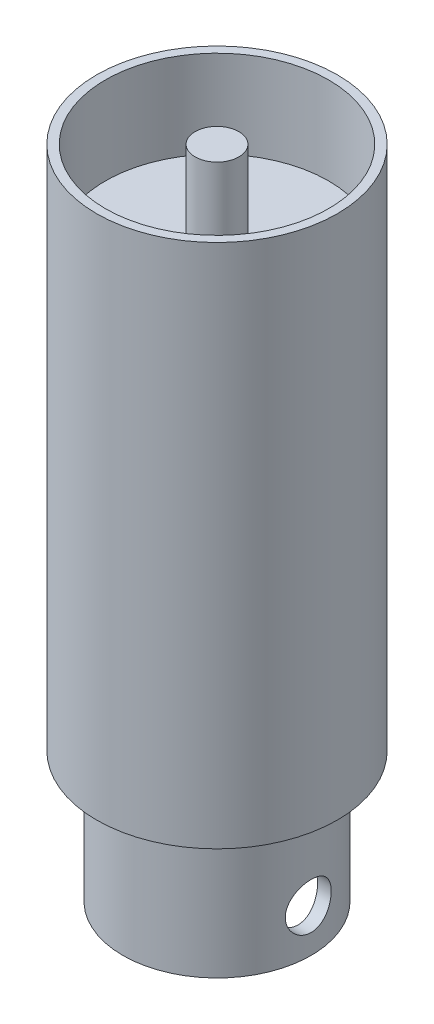
ISO-10303-21;
HEADER;
FILE_DESCRIPTION(('STEP AP214'),'2;1');
FILE_NAME('part.step','',(''),(''),'','','');
FILE_SCHEMA(('AUTOMOTIVE_DESIGN { 1 0 10303 214 1 1 1 1 }'));
ENDSEC;
DATA;
#1=APPLICATION_CONTEXT('core data for automotive mechanical design processes');
#2=APPLICATION_PROTOCOL_DEFINITION('international standard','automotive_design',2000,#1);
#3=PRODUCT_CONTEXT('',#1,'mechanical');
#4=PRODUCT('Part','Part','',(#3));
#5=PRODUCT_RELATED_PRODUCT_CATEGORY('part','',(#4));
#6=PRODUCT_DEFINITION_FORMATION('','',#4);
#7=PRODUCT_DEFINITION_CONTEXT('part definition',#1,'design');
#8=PRODUCT_DEFINITION('design','',#6,#7);
#9=PRODUCT_DEFINITION_SHAPE('','',#8);
#10=(LENGTH_UNIT() NAMED_UNIT(*) SI_UNIT(.MILLI.,.METRE.));
#11=(NAMED_UNIT(*) PLANE_ANGLE_UNIT() SI_UNIT($,.RADIAN.));
#12=(NAMED_UNIT(*) SI_UNIT($,.STERADIAN.) SOLID_ANGLE_UNIT());
#13=UNCERTAINTY_MEASURE_WITH_UNIT(LENGTH_MEASURE(1.E-05),#10,'distance_accuracy_value','');
#14=(GEOMETRIC_REPRESENTATION_CONTEXT(3) GLOBAL_UNCERTAINTY_ASSIGNED_CONTEXT((#13)) GLOBAL_UNIT_ASSIGNED_CONTEXT((#10,
#11,#12)) REPRESENTATION_CONTEXT('',''));
#15=CARTESIAN_POINT('',(0.,0.,0.));
#16=DIRECTION('',(0.,0.,1.));
#17=DIRECTION('',(1.,0.,0.));
#18=AXIS2_PLACEMENT_3D('',#15,#16,#17);
#19=CARTESIAN_POINT('',(0.,60.,0.));
#20=DIRECTION('',(0.,-1.,0.));
#21=DIRECTION('',(0.,0.,-1.));
#22=AXIS2_PLACEMENT_3D('',#19,#20,#21);
#23=CYLINDRICAL_SURFACE('',#22,13.75);
#24=CARTESIAN_POINT('',(0.,60.,0.));
#25=DIRECTION('',(0.,1.,0.));
#26=DIRECTION('',(0.,0.,1.));
#27=AXIS2_PLACEMENT_3D('',#24,#25,#26);
#28=CIRCLE('',#27,13.75);
#29=CARTESIAN_POINT('',(0.,60.,13.75));
#30=VERTEX_POINT('',#29);
#31=EDGE_CURVE('E58',#30,#30,#28,.T.);
#32=ORIENTED_EDGE('',*,*,#31,.F.);
#33=EDGE_LOOP('',(#32));
#34=FACE_BOUND('',#33,.T.);
#35=CARTESIAN_POINT('',(0.,0.,0.));
#36=DIRECTION('',(0.,1.,0.));
#37=DIRECTION('',(0.,0.,1.));
#38=AXIS2_PLACEMENT_3D('',#35,#36,#37);
#39=CIRCLE('',#38,13.75);
#40=CARTESIAN_POINT('',(0.,0.,13.75));
#41=VERTEX_POINT('',#40);
#42=EDGE_CURVE('E125',#41,#41,#39,.T.);
#43=ORIENTED_EDGE('',*,*,#42,.T.);
#44=EDGE_LOOP('',(#43));
#45=FACE_BOUND('',#44,.T.);
#46=ADVANCED_FACE('F45',(#34,#45),#23,.T.);
#47=CARTESIAN_POINT('',(0.,60.,0.));
#48=DIRECTION('',(0.,1.,0.));
#49=DIRECTION('',(0.,0.,1.));
#50=AXIS2_PLACEMENT_3D('',#47,#48,#49);
#51=PLANE('',#50);
#52=CARTESIAN_POINT('',(0.,60.,0.));
#53=DIRECTION('',(0.,1.,0.));
#54=DIRECTION('',(0.,0.,1.));
#55=AXIS2_PLACEMENT_3D('',#52,#53,#54);
#56=CIRCLE('',#55,12.75);
#57=CARTESIAN_POINT('',(0.,60.,12.75));
#58=VERTEX_POINT('',#57);
#59=EDGE_CURVE('E162',#58,#58,#56,.T.);
#60=ORIENTED_EDGE('',*,*,#59,.F.);
#61=EDGE_LOOP('',(#60));
#62=FACE_BOUND('',#61,.T.);
#63=ORIENTED_EDGE('',*,*,#31,.T.);
#64=EDGE_LOOP('',(#63));
#65=FACE_BOUND('',#64,.T.);
#66=ADVANCED_FACE('F178',(#62,#65),#51,.T.);
#67=CARTESIAN_POINT('',(0.,0.,0.));
#68=DIRECTION('',(0.,1.,0.));
#69=DIRECTION('',(0.,0.,1.));
#70=AXIS2_PLACEMENT_3D('',#67,#68,#69);
#71=PLANE('',#70);
#72=CARTESIAN_POINT('',(0.,0.,0.));
#73=DIRECTION('',(0.,1.,0.));
#74=DIRECTION('',(0.,0.,1.));
#75=AXIS2_PLACEMENT_3D('',#72,#73,#74);
#76=CIRCLE('',#75,10.75);
#77=CARTESIAN_POINT('',(0.,0.,10.75));
#78=VERTEX_POINT('',#77);
#79=EDGE_CURVE('E11',#78,#78,#76,.F.);
#80=ORIENTED_EDGE('',*,*,#79,.F.);
#81=EDGE_LOOP('',(#80));
#82=FACE_BOUND('',#81,.T.);
#83=ORIENTED_EDGE('',*,*,#42,.F.);
#84=EDGE_LOOP('',(#83));
#85=FACE_BOUND('',#84,.T.);
#86=ADVANCED_FACE('F171',(#82,#85),#71,.F.);
#87=CARTESIAN_POINT('',(0.,-14.9,0.));
#88=DIRECTION('',(0.,1.,0.));
#89=DIRECTION('',(0.,0.,1.));
#90=AXIS2_PLACEMENT_3D('',#87,#88,#89);
#91=CYLINDRICAL_SURFACE('',#90,9.25);
#92=CARTESIAN_POINT('',(-8.8697167373034,-10.,-2.625));
#93=CARTESIAN_POINT('',(-8.86971881552217,-9.85577529620719,-2.62499730258304));
#94=CARTESIAN_POINT('',(-8.87327293611824,-9.71152321388674,-2.61307337610954));
#95=CARTESIAN_POINT('',(-8.88705586606189,-9.42721074644726,-2.56579916746884));
#96=CARTESIAN_POINT('',(-8.89728745533017,-9.28715213253599,-2.5304391284349));
#97=CARTESIAN_POINT('',(-8.92317525097749,-9.01538180248594,-2.43756942595713));
#98=CARTESIAN_POINT('',(-8.93882313500438,-8.88365764529001,-2.38009372905987));
#99=CARTESIAN_POINT('',(-8.97376947150416,-8.63169471573319,-2.24473341498614));
#100=CARTESIAN_POINT('',(-8.9930683420725,-8.51145726115625,-2.16684646000531));
#101=CARTESIAN_POINT('',(-9.03375484194912,-8.28247611470968,-1.99051449147671));
#102=CARTESIAN_POINT('',(-9.0551833201506,-8.17410585310394,-1.89159386852323));
#103=CARTESIAN_POINT('',(-9.09736385817436,-7.97524886798926,-1.67702364204737));
#104=CARTESIAN_POINT('',(-9.11811583954239,-7.88476421258003,-1.56137210661621));
#105=CARTESIAN_POINT('',(-9.15706513466771,-7.72265769220686,-1.31399997464329));
#106=CARTESIAN_POINT('',(-9.17520867139229,-7.65141183377415,-1.18202376998814));
#107=CARTESIAN_POINT('',(-9.20642515659199,-7.53226569223404,-0.907363180997246));
#108=CARTESIAN_POINT('',(-9.21949907828465,-7.48436092786705,-0.764680858205653));
#109=CARTESIAN_POINT('',(-9.23881432660817,-7.41447898486085,-0.476560757863444));
#110=CARTESIAN_POINT('',(-9.24522304704051,-7.39186546507399,-0.331288742905194));
#111=CARTESIAN_POINT('',(-9.2510731886142,-7.37120084867576,-0.0388809061629942));
#112=CARTESIAN_POINT('',(-9.25051592427905,-7.37314511786164,0.108254558741657));
#113=CARTESIAN_POINT('',(-9.24261738001303,-7.4011032399804,0.395766031935412));
#114=CARTESIAN_POINT('',(-9.23547009915249,-7.42642881394942,0.536215125603046));
#115=CARTESIAN_POINT('',(-9.21542691959906,-7.49931254133875,0.810781239327962));
#116=CARTESIAN_POINT('',(-9.20253067320782,-7.54687203947884,0.944897875854568));
#117=CARTESIAN_POINT('',(-9.17216066022366,-7.66336996115971,1.20468830531623));
#118=CARTESIAN_POINT('',(-9.15463880954069,-7.73253444504456,1.33025487342421));
#119=CARTESIAN_POINT('',(-9.11689103898823,-7.89010299312113,1.56822697167863));
#120=CARTESIAN_POINT('',(-9.09666453357374,-7.97851122610331,1.68062964199072));
#121=CARTESIAN_POINT('',(-9.05485911729877,-8.17567022346683,1.893192372139));
#122=CARTESIAN_POINT('',(-9.03325762939616,-8.28501954036206,1.99279351367796));
#123=CARTESIAN_POINT('',(-8.99175923476624,-8.51908732205502,2.17239160265296));
#124=CARTESIAN_POINT('',(-8.97186246258793,-8.6438069981064,2.25238700358167));
#125=CARTESIAN_POINT('',(-8.9359265787378,-8.906415690026,2.39100532617832));
#126=CARTESIAN_POINT('',(-8.91991869717026,-9.04439964980289,2.44945705640036));
#127=CARTESIAN_POINT('',(-8.89395103412583,-9.32880754617821,2.54214040142022));
#128=CARTESIAN_POINT('',(-8.88398952057391,-9.47522905253908,2.57637895291968));
#129=CARTESIAN_POINT('',(-8.87161714143981,-9.76708181578993,2.61866025655436));
#130=CARTESIAN_POINT('',(-8.86896376616393,-9.91238097149148,2.62754472135811));
#131=CARTESIAN_POINT('',(-8.87084099697169,-10.2023928748681,2.62120055398988));
#132=CARTESIAN_POINT('',(-8.87537072097517,-10.3471056923575,2.60597488252805));
#133=CARTESIAN_POINT('',(-8.89086758743564,-10.6284620917492,2.55258864636305));
#134=CARTESIAN_POINT('',(-8.9016875779512,-10.7652139745391,2.51495188469431));
#135=CARTESIAN_POINT('',(-8.92839771035769,-11.0304589828334,2.41840991354142));
#136=CARTESIAN_POINT('',(-8.94428857681693,-11.1589509249354,2.35950166445444));
#137=CARTESIAN_POINT('',(-8.97983389567989,-11.4075011531144,2.22043672518827));
#138=CARTESIAN_POINT('',(-8.9995708997842,-11.5272762676384,2.13979553162373));
#139=CARTESIAN_POINT('',(-9.0403990372854,-11.7519027970648,1.96014162217962));
#140=CARTESIAN_POINT('',(-9.06149045947992,-11.8567510137244,1.86112497960677));
#141=CARTESIAN_POINT('',(-9.10349996320064,-12.0521347533708,1.64360532320447));
#142=CARTESIAN_POINT('',(-9.12438895321019,-12.14207832725,1.52456377431862));
#143=CARTESIAN_POINT('',(-9.16292695442611,-12.3007161874911,1.2725913698219));
#144=CARTESIAN_POINT('',(-9.18057613566941,-12.369411589164,1.13966124370895));
#145=CARTESIAN_POINT('',(-9.21053325330265,-12.4829491278337,0.864608422170627));
#146=CARTESIAN_POINT('',(-9.22288148082646,-12.5279718061838,0.722564856781578));
#147=CARTESIAN_POINT('',(-9.24102329484759,-12.5933834396975,0.432519751360427));
#148=CARTESIAN_POINT('',(-9.24681854283938,-12.6137786391967,0.284519731435076));
#149=CARTESIAN_POINT('',(-9.25111154249764,-12.6289227563912,-0.00773788647497587));
#150=CARTESIAN_POINT('',(-9.24985490125331,-12.6245348002913,-0.15194774396092));
#151=CARTESIAN_POINT('',(-9.24075248154151,-12.5922708683375,-0.437491494590992));
#152=CARTESIAN_POINT('',(-9.23290701123292,-12.5643959909644,-0.57882552192079));
#153=CARTESIAN_POINT('',(-9.21156820420505,-12.4864619863723,-0.853422755174489));
#154=CARTESIAN_POINT('',(-9.1981246794634,-12.4365982922259,-0.986745558917899));
#155=CARTESIAN_POINT('',(-9.1669866259515,-12.3162759174661,-1.2432066265273));
#156=CARTESIAN_POINT('',(-9.14929144501282,-12.24581407691,-1.36634332403081));
#157=CARTESIAN_POINT('',(-9.11087788579482,-12.0838843411139,-1.60287019088081));
#158=CARTESIAN_POINT('',(-9.09008586507005,-11.9918593005998,-1.71586690257861));
#159=CARTESIAN_POINT('',(-9.04808733297896,-11.7904451494235,-1.92510454072038));
#160=CARTESIAN_POINT('',(-9.02688070911617,-11.6810512669957,-2.02134084727552));
#161=CARTESIAN_POINT('',(-8.98581645713702,-11.444611363161,-2.19680412812974));
#162=CARTESIAN_POINT('',(-8.96600777661294,-11.3171825982681,-2.27552795536924));
#163=CARTESIAN_POINT('',(-8.93071604917814,-11.0503527786649,-2.41033122581506));
#164=CARTESIAN_POINT('',(-8.91523053908389,-10.9109586008489,-2.46642357175219));
#165=CARTESIAN_POINT('',(-8.89218416962911,-10.6436763217177,-2.5481572885245));
#166=CARTESIAN_POINT('',(-8.88383259471519,-10.5167972469709,-2.57689998325676));
#167=CARTESIAN_POINT('',(-8.87259835970681,-10.2599525450958,-2.61532109853033));
#168=CARTESIAN_POINT('',(-8.86971486423844,-10.1299873925084,-2.62500243113827));
#169=CARTESIAN_POINT('',(-8.8697167373034,-10.,-2.625));
#170=B_SPLINE_CURVE_WITH_KNOTS('',3,(#92,#93,#94,#95,#96,#97,#98,#99,#100,#101,#102,#103,#104,
#105,#106,#107,#108,#109,#110,#111,#112,#113,#114,#115,#116,#117,#118,#119,#120,#121,#122,#123,
#124,#125,#126,#127,#128,#129,#130,#131,#132,#133,#134,#135,#136,#137,#138,#139,#140,#141,#142,
#143,#144,#145,#146,#147,#148,#149,#150,#151,#152,#153,#154,#155,#156,#157,#158,#159,#160,#161,
#162,#163,#164,#165,#166,#167,#168,#169),.UNSPECIFIED.,.T.,.F.,(4,2,2,2,2,2,2,2,2,2,2,2,2,2,2,2,
2,2,2,2,2,2,2,2,2,2,2,2,2,2,2,2,2,2,2,2,2,2,4),(0.,0.432195389283281,0.86457082224056,
1.29628482088833,1.72804828754548,2.17087446533698,2.61375181688463,3.06474410994401,
3.51564978278478,3.95493560726135,4.39413853709469,4.82081116753356,5.24750960670321,
5.67883138721868,6.1102466985117,6.55660535264544,7.00299920437433,7.45286741269873,
7.902606688464,8.33723119050378,8.77180232505635,9.19659450627733,9.62144741248607,
10.0566924712249,10.4920306458354,10.9418465918648,11.3916389231654,11.8379492211459,
12.2841463326782,12.7149016885251,13.1456368991078,13.5726186284537,13.9996658950779,
14.4392802974416,14.87901568532,15.3301011996303,15.7809291750173,16.1705194116568,
16.5600501247017),.UNSPECIFIED.);
#171=CARTESIAN_POINT('',(-8.8697167373034,-10.,-2.625));
#172=VERTEX_POINT('',#171);
#173=EDGE_CURVE('E114',#172,#172,#170,.T.);
#174=ORIENTED_EDGE('',*,*,#173,.F.);
#175=EDGE_LOOP('',(#174));
#176=FACE_BOUND('',#175,.T.);
#177=DIRECTION('',(0.,1.,0.));
#178=VECTOR('',#177,1.);
#179=CARTESIAN_POINT('',(-0.75,-14.9,-9.21954445729289));
#180=LINE('',#179,#178);
#181=CARTESIAN_POINT('',(-0.75,-14.9,-9.21954445729289));
#182=VERTEX_POINT('',#181);
#183=CARTESIAN_POINT('',(-0.750000000000003,20.,-9.21954445729289));
#184=VERTEX_POINT('',#183);
#185=EDGE_CURVE('E66',#182,#184,#180,.T.);
#186=ORIENTED_EDGE('',*,*,#185,.T.);
#187=CARTESIAN_POINT('',(0.,20.,0.));
#188=DIRECTION('',(0.,-1.,0.));
#189=DIRECTION('',(0.,0.,-1.));
#190=AXIS2_PLACEMENT_3D('',#187,#188,#189);
#191=CIRCLE('',#190,9.25);
#192=CARTESIAN_POINT('',(-0.749999999999999,20.,9.21954445729289));
#193=VERTEX_POINT('',#192);
#194=EDGE_CURVE('E92',#193,#184,#191,.T.);
#195=ORIENTED_EDGE('',*,*,#194,.F.);
#196=DIRECTION('',(0.,1.,0.));
#197=VECTOR('',#196,1.);
#198=CARTESIAN_POINT('',(-0.75,-14.9,9.21954445729289));
#199=LINE('',#198,#197);
#200=CARTESIAN_POINT('',(-0.75,-14.9,9.21954445729289));
#201=VERTEX_POINT('',#200);
#202=EDGE_CURVE('E73',#201,#193,#199,.T.);
#203=ORIENTED_EDGE('',*,*,#202,.F.);
#204=CARTESIAN_POINT('',(0.,-14.9,0.));
#205=DIRECTION('',(0.,-1.,0.));
#206=DIRECTION('',(0.,0.,-1.));
#207=AXIS2_PLACEMENT_3D('',#204,#205,#206);
#208=CIRCLE('',#207,9.25);
#209=EDGE_CURVE('E94',#201,#182,#208,.T.);
#210=ORIENTED_EDGE('',*,*,#209,.T.);
#211=EDGE_LOOP('',(#186,#195,#203,#210));
#212=FACE_BOUND('',#211,.T.);
#213=ADVANCED_FACE('F91',(#176,#212),#91,.F.);
#214=CARTESIAN_POINT('',(8.8697167373034,-10.,-2.625));
#215=CARTESIAN_POINT('',(8.86971881552217,-10.1442247037928,-2.62499730258304));
#216=CARTESIAN_POINT('',(8.87327293611824,-10.2884767861133,-2.61307337610954));
#217=CARTESIAN_POINT('',(8.88705586606189,-10.5727892535527,-2.56579916746884));
#218=CARTESIAN_POINT('',(8.89728745533017,-10.712847867464,-2.5304391284349));
#219=CARTESIAN_POINT('',(8.92317525097749,-10.9846181975141,-2.43756942595713));
#220=CARTESIAN_POINT('',(8.93882313500438,-11.11634235471,-2.38009372905987));
#221=CARTESIAN_POINT('',(8.97376947150416,-11.3683052842668,-2.24473341498614));
#222=CARTESIAN_POINT('',(8.9930683420725,-11.4885427388438,-2.16684646000531));
#223=CARTESIAN_POINT('',(9.03375484194911,-11.7175238852903,-1.99051449147671));
#224=CARTESIAN_POINT('',(9.0551833201506,-11.8258941468961,-1.89159386852323));
#225=CARTESIAN_POINT('',(9.09736385817436,-12.0247511320107,-1.67702364204737));
#226=CARTESIAN_POINT('',(9.11811583954239,-12.11523578742,-1.56137210661621));
#227=CARTESIAN_POINT('',(9.15706513466771,-12.2773423077931,-1.31399997464329));
#228=CARTESIAN_POINT('',(9.17520867139229,-12.3485881662258,-1.18202376998814));
#229=CARTESIAN_POINT('',(9.20642515659199,-12.467734307766,-0.907363180997247));
#230=CARTESIAN_POINT('',(9.21949907828465,-12.515639072133,-0.764680858205654));
#231=CARTESIAN_POINT('',(9.23881432660817,-12.5855210151392,-0.476560757863444));
#232=CARTESIAN_POINT('',(9.24522304704051,-12.608134534926,-0.331288742905194));
#233=CARTESIAN_POINT('',(9.2510731886142,-12.6287991513242,-0.038880906162994));
#234=CARTESIAN_POINT('',(9.25051592427905,-12.6268548821384,0.108254558741658));
#235=CARTESIAN_POINT('',(9.24261738001303,-12.5988967600196,0.395766031935413));
#236=CARTESIAN_POINT('',(9.23547009915249,-12.5735711860506,0.536215125603047));
#237=CARTESIAN_POINT('',(9.21542691959906,-12.5006874586612,0.810781239327962));
#238=CARTESIAN_POINT('',(9.20253067320782,-12.4531279605212,0.944897875854568));
#239=CARTESIAN_POINT('',(9.17216066022366,-12.3366300388403,1.20468830531623));
#240=CARTESIAN_POINT('',(9.15463880954069,-12.2674655549554,1.33025487342421));
#241=CARTESIAN_POINT('',(9.11689103898823,-12.1098970068789,1.56822697167863));
#242=CARTESIAN_POINT('',(9.09666453357374,-12.0214887738967,1.68062964199072));
#243=CARTESIAN_POINT('',(9.05485911729877,-11.8243297765332,1.89319237213901));
#244=CARTESIAN_POINT('',(9.03325762939616,-11.7149804596379,1.99279351367796));
#245=CARTESIAN_POINT('',(8.99175923476624,-11.480912677945,2.17239160265296));
#246=CARTESIAN_POINT('',(8.97186246258793,-11.3561930018936,2.25238700358167));
#247=CARTESIAN_POINT('',(8.9359265787378,-11.093584309974,2.39100532617832));
#248=CARTESIAN_POINT('',(8.91991869717026,-10.9556003501971,2.44945705640036));
#249=CARTESIAN_POINT('',(8.89395103412583,-10.6711924538218,2.54214040142022));
#250=CARTESIAN_POINT('',(8.88398952057391,-10.5247709474609,2.57637895291968));
#251=CARTESIAN_POINT('',(8.87161714143981,-10.2329181842101,2.61866025655436));
#252=CARTESIAN_POINT('',(8.86896376616393,-10.0876190285085,2.62754472135811));
#253=CARTESIAN_POINT('',(8.87084099697169,-9.79760712513186,2.62120055398988));
#254=CARTESIAN_POINT('',(8.87537072097517,-9.6528943076425,2.60597488252805));
#255=CARTESIAN_POINT('',(8.89086758743564,-9.37153790825077,2.55258864636305));
#256=CARTESIAN_POINT('',(8.9016875779512,-9.23478602546089,2.51495188469431));
#257=CARTESIAN_POINT('',(8.92839771035769,-8.96954101716664,2.41840991354142));
#258=CARTESIAN_POINT('',(8.94428857681693,-8.84104907506458,2.35950166445444));
#259=CARTESIAN_POINT('',(8.97983389567989,-8.59249884688558,2.22043672518827));
#260=CARTESIAN_POINT('',(8.9995708997842,-8.4727237323616,2.13979553162373));
#261=CARTESIAN_POINT('',(9.0403990372854,-8.24809720293523,1.96014162217962));
#262=CARTESIAN_POINT('',(9.06149045947992,-8.14324898627558,1.86112497960677));
#263=CARTESIAN_POINT('',(9.10349996320064,-7.94786524662921,1.64360532320447));
#264=CARTESIAN_POINT('',(9.12438895321019,-7.85792167275,1.52456377431862));
#265=CARTESIAN_POINT('',(9.16292695442611,-7.69928381250888,1.2725913698219));
#266=CARTESIAN_POINT('',(9.18057613566941,-7.63058841083599,1.13966124370895));
#267=CARTESIAN_POINT('',(9.21053325330265,-7.51705087216626,0.864608422170627));
#268=CARTESIAN_POINT('',(9.22288148082646,-7.47202819381615,0.722564856781578));
#269=CARTESIAN_POINT('',(9.24102329484759,-7.40661656030247,0.432519751360426));
#270=CARTESIAN_POINT('',(9.24681854283938,-7.38622136080331,0.284519731435075));
#271=CARTESIAN_POINT('',(9.25111154249764,-7.37107724360884,-0.00773788647497728));
#272=CARTESIAN_POINT('',(9.24985490125331,-7.3754651997087,-0.151947743960922));
#273=CARTESIAN_POINT('',(9.24075248154151,-7.4077291316625,-0.437491494590994));
#274=CARTESIAN_POINT('',(9.23290701123292,-7.43560400903561,-0.578825521920791));
#275=CARTESIAN_POINT('',(9.21156820420505,-7.51353801362773,-0.853422755174489));
#276=CARTESIAN_POINT('',(9.1981246794634,-7.56340170777406,-0.986745558917899));
#277=CARTESIAN_POINT('',(9.1669866259515,-7.68372408253389,-1.2432066265273));
#278=CARTESIAN_POINT('',(9.14929144501282,-7.75418592309002,-1.36634332403081));
#279=CARTESIAN_POINT('',(9.11087788579482,-7.91611565888613,-1.60287019088081));
#280=CARTESIAN_POINT('',(9.09008586507005,-8.00814069940019,-1.71586690257861));
#281=CARTESIAN_POINT('',(9.04808733297896,-8.2095548505765,-1.92510454072038));
#282=CARTESIAN_POINT('',(9.02688070911617,-8.31894873300434,-2.02134084727552));
#283=CARTESIAN_POINT('',(8.98581645713702,-8.55538863683898,-2.19680412812974));
#284=CARTESIAN_POINT('',(8.96600777661294,-8.68281740173187,-2.27552795536924));
#285=CARTESIAN_POINT('',(8.93071604917814,-8.94964722133508,-2.41033122581506));
#286=CARTESIAN_POINT('',(8.91523053908389,-9.08904139915115,-2.46642357175219));
#287=CARTESIAN_POINT('',(8.89218416962911,-9.35632367828233,-2.5481572885245));
#288=CARTESIAN_POINT('',(8.88383259471519,-9.48320275302907,-2.57689998325676));
#289=CARTESIAN_POINT('',(8.87259835970681,-9.74004745490424,-2.61532109853033));
#290=CARTESIAN_POINT('',(8.86971486423844,-9.87001260749158,-2.62500243113827));
#291=CARTESIAN_POINT('',(8.8697167373034,-10.,-2.625));
#292=B_SPLINE_CURVE_WITH_KNOTS('',3,(#214,#215,#216,#217,#218,#219,#220,#221,#222,#223,#224,
#225,#226,#227,#228,#229,#230,#231,#232,#233,#234,#235,#236,#237,#238,#239,#240,#241,#242,#243,
#244,#245,#246,#247,#248,#249,#250,#251,#252,#253,#254,#255,#256,#257,#258,#259,#260,#261,#262,
#263,#264,#265,#266,#267,#268,#269,#270,#271,#272,#273,#274,#275,#276,#277,#278,#279,#280,#281,
#282,#283,#284,#285,#286,#287,#288,#289,#290,#291),.UNSPECIFIED.,.T.,.F.,(4,2,2,2,2,2,2,2,2,2,2,
2,2,2,2,2,2,2,2,2,2,2,2,2,2,2,2,2,2,2,2,2,2,2,2,2,2,2,4),(0.,0.432195389283281,0.86457082224056,
1.29628482088833,1.72804828754548,2.17087446533698,2.61375181688463,3.06474410994401,
3.51564978278478,3.95493560726135,4.39413853709469,4.82081116753356,5.24750960670321,
5.67883138721868,6.1102466985117,6.55660535264545,7.00299920437433,7.45286741269873,
7.902606688464,8.33723119050378,8.77180232505635,9.19659450627733,9.62144741248607,
10.0566924712249,10.4920306458354,10.9418465918648,11.3916389231653,11.8379492211459,
12.2841463326782,12.7149016885251,13.1456368991078,13.5726186284537,13.9996658950779,
14.4392802974416,14.87901568532,15.3301011996303,15.7809291750173,16.1705194116568,
16.5600501247017),.UNSPECIFIED.);
#293=CARTESIAN_POINT('',(8.8697167373034,-10.,-2.625));
#294=VERTEX_POINT('',#293);
#295=EDGE_CURVE('E155',#294,#294,#292,.T.);
#296=ORIENTED_EDGE('',*,*,#295,.F.);
#297=EDGE_LOOP('',(#296));
#298=FACE_BOUND('',#297,.T.);
#299=DIRECTION('',(0.,1.,0.));
#300=VECTOR('',#299,1.);
#301=CARTESIAN_POINT('',(0.75,-14.9,9.21954445729289));
#302=LINE('',#301,#300);
#303=CARTESIAN_POINT('',(0.75,-14.9,9.21954445729289));
#304=VERTEX_POINT('',#303);
#305=CARTESIAN_POINT('',(0.75,20.,9.21954445729289));
#306=VERTEX_POINT('',#305);
#307=EDGE_CURVE('E122',#304,#306,#302,.T.);
#308=ORIENTED_EDGE('',*,*,#307,.T.);
#309=CARTESIAN_POINT('',(0.,20.,0.));
#310=DIRECTION('',(0.,-1.,0.));
#311=DIRECTION('',(0.,0.,-1.));
#312=AXIS2_PLACEMENT_3D('',#309,#310,#311);
#313=CIRCLE('',#312,9.25);
#314=CARTESIAN_POINT('',(0.75,20.,-9.21954445729289));
#315=VERTEX_POINT('',#314);
#316=EDGE_CURVE('E101',#315,#306,#313,.T.);
#317=ORIENTED_EDGE('',*,*,#316,.F.);
#318=DIRECTION('',(0.,1.,0.));
#319=VECTOR('',#318,1.);
#320=CARTESIAN_POINT('',(0.75,-14.9,-9.21954445729289));
#321=LINE('',#320,#319);
#322=CARTESIAN_POINT('',(0.75,-14.9,-9.21954445729289));
#323=VERTEX_POINT('',#322);
#324=EDGE_CURVE('E96',#323,#315,#321,.T.);
#325=ORIENTED_EDGE('',*,*,#324,.F.);
#326=EDGE_CURVE('E104',#323,#304,#208,.T.);
#327=ORIENTED_EDGE('',*,*,#326,.T.);
#328=EDGE_LOOP('',(#308,#317,#325,#327));
#329=FACE_BOUND('',#328,.T.);
#330=ADVANCED_FACE('F170',(#298,#329),#91,.F.);
#331=CARTESIAN_POINT('',(-0.75,-14.9,0.));
#332=DIRECTION('',(-1.,0.,0.));
#333=DIRECTION('',(0.,0.,1.));
#334=AXIS2_PLACEMENT_3D('',#331,#332,#333);
#335=PLANE('',#334);
#336=ORIENTED_EDGE('',*,*,#202,.T.);
#337=DIRECTION('',(0.,0.,1.));
#338=VECTOR('',#337,1.);
#339=CARTESIAN_POINT('',(-0.75,20.,0.));
#340=LINE('',#339,#338);
#341=EDGE_CURVE('E100',#184,#193,#340,.T.);
#342=ORIENTED_EDGE('',*,*,#341,.F.);
#343=ORIENTED_EDGE('',*,*,#185,.F.);
#344=DIRECTION('',(0.,0.,1.));
#345=VECTOR('',#344,1.);
#346=CARTESIAN_POINT('',(-0.75,-14.9,0.));
#347=LINE('',#346,#345);
#348=EDGE_CURVE('E118',#182,#201,#347,.T.);
#349=ORIENTED_EDGE('',*,*,#348,.T.);
#350=EDGE_LOOP('',(#336,#342,#343,#349));
#351=FACE_BOUND('',#350,.T.);
#352=ADVANCED_FACE('F103',(#351),#335,.T.);
#353=CARTESIAN_POINT('',(0.75,-14.9,0.));
#354=DIRECTION('',(-1.,0.,0.));
#355=DIRECTION('',(0.,0.,1.));
#356=AXIS2_PLACEMENT_3D('',#353,#354,#355);
#357=PLANE('',#356);
#358=ORIENTED_EDGE('',*,*,#324,.T.);
#359=DIRECTION('',(0.,0.,-1.));
#360=VECTOR('',#359,1.);
#361=CARTESIAN_POINT('',(0.75,20.,0.));
#362=LINE('',#361,#360);
#363=EDGE_CURVE('E111',#306,#315,#362,.T.);
#364=ORIENTED_EDGE('',*,*,#363,.F.);
#365=ORIENTED_EDGE('',*,*,#307,.F.);
#366=DIRECTION('',(0.,0.,1.));
#367=VECTOR('',#366,1.);
#368=CARTESIAN_POINT('',(0.75,-14.9,0.));
#369=LINE('',#368,#367);
#370=EDGE_CURVE('E107',#323,#304,#369,.T.);
#371=ORIENTED_EDGE('',*,*,#370,.F.);
#372=EDGE_LOOP('',(#358,#364,#365,#371));
#373=FACE_BOUND('',#372,.T.);
#374=ADVANCED_FACE('F173',(#373),#357,.F.);
#375=CARTESIAN_POINT('',(0.,-14.9,0.));
#376=DIRECTION('',(0.,1.,0.));
#377=DIRECTION('',(0.,0.,1.));
#378=AXIS2_PLACEMENT_3D('',#375,#376,#377);
#379=CYLINDRICAL_SURFACE('',#378,10.75);
#380=CARTESIAN_POINT('',(-10.4245803272842,-10.,-2.625));
#381=CARTESIAN_POINT('',(-10.4245831548927,-9.85493102243143,-2.62499569061444));
#382=CARTESIAN_POINT('',(-10.4276415609656,-9.70981360397683,-2.61293332696976));
#383=CARTESIAN_POINT('',(-10.4395152293765,-9.42373814829758,-2.56507473223309));
#384=CARTESIAN_POINT('',(-10.448333998944,-9.28278269979517,-2.52926404163674));
#385=CARTESIAN_POINT('',(-10.4706714112928,-9.0092104673874,-2.43513045242197));
#386=CARTESIAN_POINT('',(-10.4841841641742,-8.87658347823069,-2.3768357561406));
#387=CARTESIAN_POINT('',(-10.5143797181745,-8.62297953602556,-2.239473904271));
#388=CARTESIAN_POINT('',(-10.5310626156357,-8.50200293720677,-2.16040611735015));
#389=CARTESIAN_POINT('',(-10.5661108329947,-8.27259277885317,-1.98196935627417));
#390=CARTESIAN_POINT('',(-10.5845020174492,-8.16443992129541,-1.88224450425205));
#391=CARTESIAN_POINT('',(-10.620669823771,-7.96621739365295,-1.66609132907616));
#392=CARTESIAN_POINT('',(-10.6384463900571,-7.87614935549024,-1.5496615001373));
#393=CARTESIAN_POINT('',(-10.6716673355654,-7.71551211641701,-1.30148827913955));
#394=CARTESIAN_POINT('',(-10.6870776324537,-7.64521755574191,-1.16956216163142));
#395=CARTESIAN_POINT('',(-10.7135352081221,-7.52790664911997,-0.895327680626243));
#396=CARTESIAN_POINT('',(-10.7245831001368,-7.4808870311178,-0.753020779717445));
#397=CARTESIAN_POINT('',(-10.7408882368632,-7.41235667208561,-0.464989282575979));
#398=CARTESIAN_POINT('',(-10.7462534832963,-7.39036954515204,-0.319384250265262));
#399=CARTESIAN_POINT('',(-10.7509647487366,-7.37103410527749,-0.0264600616033844));
#400=CARTESIAN_POINT('',(-10.7503116183515,-7.37368231050049,0.120858849577183));
#401=CARTESIAN_POINT('',(-10.7431405364628,-7.40319735155438,0.409728864261844));
#402=CARTESIAN_POINT('',(-10.7367470765144,-7.42955012457459,0.551336045258601));
#403=CARTESIAN_POINT('',(-10.718958036947,-7.50490134515293,0.828054431676683));
#404=CARTESIAN_POINT('',(-10.7075621980999,-7.5539009662986,0.963165300050446));
#405=CARTESIAN_POINT('',(-10.6808564820379,-7.6735783535,1.2244242330887));
#406=CARTESIAN_POINT('',(-10.6655133513554,-7.74444136869223,1.35048390025262));
#407=CARTESIAN_POINT('',(-10.6325809882869,-7.90569397919236,1.58910408290916));
#408=CARTESIAN_POINT('',(-10.6149913814983,-7.99608683112529,1.70166234215078));
#409=CARTESIAN_POINT('',(-10.5789498916491,-8.19659758852733,1.91314909532593));
#410=CARTESIAN_POINT('',(-10.5604874722679,-8.3071649040646,2.01165014926645));
#411=CARTESIAN_POINT('',(-10.5251990946247,-8.54344182289712,2.18880482749055));
#412=CARTESIAN_POINT('',(-10.508373205831,-8.66915206848041,2.2674576094706));
#413=CARTESIAN_POINT('',(-10.4782269710797,-8.93295571837205,2.40293994493129));
#414=CARTESIAN_POINT('',(-10.4649225346462,-9.0711016664384,2.45967097131763));
#415=CARTESIAN_POINT('',(-10.4435323107245,-9.35537236596814,2.54897315993385));
#416=CARTESIAN_POINT('',(-10.4354454644629,-9.50149549214021,2.58154922398202));
#417=CARTESIAN_POINT('',(-10.4256270923981,-9.79361996520651,2.62091671627347));
#418=CARTESIAN_POINT('',(-10.4237402946719,-9.93953127814868,2.62833825849398));
#419=CARTESIAN_POINT('',(-10.4261137360236,-10.2305072525252,2.61890739029234));
#420=CARTESIAN_POINT('',(-10.4303734380274,-10.3755719868205,2.60205710071527));
#421=CARTESIAN_POINT('',(-10.4444115393737,-10.6584260399391,2.54511230647069));
#422=CARTESIAN_POINT('',(-10.4541037056229,-10.7962931130867,2.50538074700532));
#423=CARTESIAN_POINT('',(-10.4778335987911,-11.0634109749987,2.40420179188223));
#424=CARTESIAN_POINT('',(-10.4918718220199,-11.1926607776407,2.3427519159287));
#425=CARTESIAN_POINT('',(-10.5230417591684,-11.4415561677601,2.19854837179908));
#426=CARTESIAN_POINT('',(-10.5402266924252,-11.5609753821095,2.11541573807775));
#427=CARTESIAN_POINT('',(-10.5756213198518,-11.7844001245358,1.93068889742777));
#428=CARTESIAN_POINT('',(-10.5938311740327,-11.8884032365839,1.82909180227048));
#429=CARTESIAN_POINT('',(-10.629747287054,-12.0805750346455,1.60743596326432));
#430=CARTESIAN_POINT('',(-10.6474313168387,-12.1683090317406,1.48699609056577));
#431=CARTESIAN_POINT('',(-10.6798542993862,-12.3223047068287,1.23272600028268));
#432=CARTESIAN_POINT('',(-10.6945934036439,-12.3885674894693,1.09889647203076));
#433=CARTESIAN_POINT('',(-10.7193742278525,-12.4971780692065,0.822559107230348));
#434=CARTESIAN_POINT('',(-10.7294490352566,-12.5396947745655,0.680120764023663));
#435=CARTESIAN_POINT('',(-10.7439106447381,-12.6001180565728,0.389843751371654));
#436=CARTESIAN_POINT('',(-10.7482984908291,-12.6180291503606,0.242006078261627));
#437=CARTESIAN_POINT('',(-10.7508514287353,-12.62848850697,-0.0507813350964676));
#438=CARTESIAN_POINT('',(-10.749174256713,-12.6216796561037,-0.195707090466844));
#439=CARTESIAN_POINT('',(-10.7401330797394,-12.5843581654993,-0.48228273253997));
#440=CARTESIAN_POINT('',(-10.7327692299053,-12.5538461723181,-0.623932708488509));
#441=CARTESIAN_POINT('',(-10.7132040921148,-12.4703226048176,-0.899296936015477));
#442=CARTESIAN_POINT('',(-10.7010267801085,-12.4174224554238,-1.0330467991937));
#443=CARTESIAN_POINT('',(-10.6731203171319,-12.2907262387489,-1.28984705872516));
#444=CARTESIAN_POINT('',(-10.6573907369311,-12.2169276459767,-1.41289615958472));
#445=CARTESIAN_POINT('',(-10.623627342345,-12.0485422295724,-1.64786805138676));
#446=CARTESIAN_POINT('',(-10.6055488232691,-11.9535160051711,-1.7594695440987));
#447=CARTESIAN_POINT('',(-10.5693334363329,-11.746232458872,-1.96536082852052));
#448=CARTESIAN_POINT('',(-10.5511965549836,-11.6339708240946,-2.05964627416726));
#449=CARTESIAN_POINT('',(-10.5165564216189,-11.3930275394885,-2.22985107532311));
#450=CARTESIAN_POINT('',(-10.5000874923338,-11.2640919308165,-2.30541843255941));
#451=CARTESIAN_POINT('',(-10.4711031831308,-10.9949650494596,-2.43369135754085));
#452=CARTESIAN_POINT('',(-10.4585848343642,-10.85478232879,-2.48641410410604));
#453=CARTESIAN_POINT('',(-10.4409469391977,-10.5956361835924,-2.55934122078396));
#454=CARTESIAN_POINT('',(-10.4348545375439,-10.477948359302,-2.58391090867714));
#455=CARTESIAN_POINT('',(-10.4266702150339,-10.2401846355463,-2.61674145444668));
#456=CARTESIAN_POINT('',(-10.424577986184,-10.1201089206563,-2.62500356792787));
#457=CARTESIAN_POINT('',(-10.4245803272842,-10.,-2.625));
#458=B_SPLINE_CURVE_WITH_KNOTS('',3,(#380,#381,#382,#383,#384,#385,#386,#387,#388,#389,#390,
#391,#392,#393,#394,#395,#396,#397,#398,#399,#400,#401,#402,#403,#404,#405,#406,#407,#408,#409,
#410,#411,#412,#413,#414,#415,#416,#417,#418,#419,#420,#421,#422,#423,#424,#425,#426,#427,#428,
#429,#430,#431,#432,#433,#434,#435,#436,#437,#438,#439,#440,#441,#442,#443,#444,#445,#446,#447,
#448,#449,#450,#451,#452,#453,#454,#455,#456,#457),.UNSPECIFIED.,.T.,.F.,(4,2,2,2,2,2,2,2,2,2,2,
2,2,2,2,2,2,2,2,2,2,2,2,2,2,2,2,2,2,2,2,2,2,2,2,2,2,2,4),(0.,0.434766038624945,
0.869797034032299,1.30428412284529,1.73878441805215,2.18150754276208,2.62427059959494,
3.07290973554565,3.52148578265005,3.96137441587905,4.40120087836856,4.83171318571681,
5.2622478052445,5.69653547851374,6.13089562577235,6.57648167347259,7.02208662738386,
7.46967167841859,7.91716587518253,8.3533641580048,8.78952432862857,9.21894949759982,
9.64842372404693,10.0859759800885,10.5235967374696,10.971610082967,11.4196003754847,
11.8643621052438,12.3090421739801,12.7422413521482,13.1754287142405,13.6064850148895,
14.0375934291664,14.4786250437756,14.9197671997561,15.3686642866588,15.8172232210526,
16.1772126661604,16.5371743927298),.UNSPECIFIED.);
#459=CARTESIAN_POINT('',(-10.4245803272842,-10.,-2.625));
#460=VERTEX_POINT('',#459);
#461=EDGE_CURVE('E48',#460,#460,#458,.T.);
#462=ORIENTED_EDGE('',*,*,#461,.T.);
#463=EDGE_LOOP('',(#462));
#464=FACE_BOUND('',#463,.T.);
#465=CARTESIAN_POINT('',(10.4245803272842,-10.,-2.625));
#466=CARTESIAN_POINT('',(10.4245831548927,-10.1450689775686,-2.62499569061444));
#467=CARTESIAN_POINT('',(10.4276415609656,-10.2901863960232,-2.61293332696976));
#468=CARTESIAN_POINT('',(10.4395152293765,-10.5762618517024,-2.56507473223309));
#469=CARTESIAN_POINT('',(10.448333998944,-10.7172173002048,-2.52926404163674));
#470=CARTESIAN_POINT('',(10.4706714112928,-10.9907895326126,-2.43513045242197));
#471=CARTESIAN_POINT('',(10.4841841641742,-11.1234165217693,-2.3768357561406));
#472=CARTESIAN_POINT('',(10.5143797181745,-11.3770204639744,-2.239473904271));
#473=CARTESIAN_POINT('',(10.5310626156357,-11.4979970627932,-2.16040611735015));
#474=CARTESIAN_POINT('',(10.5661108329947,-11.7274072211468,-1.98196935627417));
#475=CARTESIAN_POINT('',(10.5845020174492,-11.8355600787046,-1.88224450425205));
#476=CARTESIAN_POINT('',(10.620669823771,-12.033782606347,-1.66609132907616));
#477=CARTESIAN_POINT('',(10.6384463900571,-12.1238506445098,-1.5496615001373));
#478=CARTESIAN_POINT('',(10.6716673355654,-12.284487883583,-1.30148827913955));
#479=CARTESIAN_POINT('',(10.6870776324537,-12.3547824442581,-1.16956216163142));
#480=CARTESIAN_POINT('',(10.7135352081221,-12.47209335088,-0.895327680626243));
#481=CARTESIAN_POINT('',(10.7245831001368,-12.5191129688822,-0.753020779717444));
#482=CARTESIAN_POINT('',(10.7408882368632,-12.5876433279144,-0.464989282575978));
#483=CARTESIAN_POINT('',(10.7462534832963,-12.609630454848,-0.319384250265261));
#484=CARTESIAN_POINT('',(10.7509647487366,-12.6289658947225,-0.0264600616033836));
#485=CARTESIAN_POINT('',(10.7503116183515,-12.6263176894995,0.120858849577184));
#486=CARTESIAN_POINT('',(10.7431405364628,-12.5968026484456,0.409728864261844));
#487=CARTESIAN_POINT('',(10.7367470765144,-12.5704498754254,0.551336045258601));
#488=CARTESIAN_POINT('',(10.718958036947,-12.4950986548471,0.828054431676683));
#489=CARTESIAN_POINT('',(10.7075621980999,-12.4460990337014,0.963165300050447));
#490=CARTESIAN_POINT('',(10.6808564820379,-12.3264216465,1.2244242330887));
#491=CARTESIAN_POINT('',(10.6655133513554,-12.2555586313078,1.35048390025262));
#492=CARTESIAN_POINT('',(10.6325809882869,-12.0943060208076,1.58910408290916));
#493=CARTESIAN_POINT('',(10.6149913814983,-12.0039131688747,1.70166234215078));
#494=CARTESIAN_POINT('',(10.5789498916491,-11.8034024114727,1.91314909532594));
#495=CARTESIAN_POINT('',(10.5604874722679,-11.6928350959354,2.01165014926645));
#496=CARTESIAN_POINT('',(10.5251990946247,-11.4565581771029,2.18880482749056));
#497=CARTESIAN_POINT('',(10.508373205831,-11.3308479315196,2.2674576094706));
#498=CARTESIAN_POINT('',(10.4782269710797,-11.067044281628,2.40293994493129));
#499=CARTESIAN_POINT('',(10.4649225346462,-10.9288983335616,2.45967097131763));
#500=CARTESIAN_POINT('',(10.4435323107245,-10.6446276340319,2.54897315993385));
#501=CARTESIAN_POINT('',(10.4354454644629,-10.4985045078598,2.58154922398202));
#502=CARTESIAN_POINT('',(10.4256270923981,-10.2063800347935,2.62091671627347));
#503=CARTESIAN_POINT('',(10.4237402946719,-10.0604687218513,2.62833825849398));
#504=CARTESIAN_POINT('',(10.4261137360236,-9.76949274747483,2.61890739029234));
#505=CARTESIAN_POINT('',(10.4303734380274,-9.62442801317946,2.60205710071527));
#506=CARTESIAN_POINT('',(10.4444115393737,-9.3415739600609,2.54511230647069));
#507=CARTESIAN_POINT('',(10.4541037056229,-9.20370688691334,2.50538074700532));
#508=CARTESIAN_POINT('',(10.4778335987911,-8.93658902500129,2.40420179188223));
#509=CARTESIAN_POINT('',(10.4918718220199,-8.80733922235928,2.3427519159287));
#510=CARTESIAN_POINT('',(10.5230417591684,-8.5584438322399,2.19854837179908));
#511=CARTESIAN_POINT('',(10.5402266924252,-8.4390246178905,2.11541573807775));
#512=CARTESIAN_POINT('',(10.5756213198518,-8.21559987546424,1.93068889742777));
#513=CARTESIAN_POINT('',(10.5938311740327,-8.11159676341614,1.82909180227048));
#514=CARTESIAN_POINT('',(10.629747287054,-7.91942496535452,1.60743596326432));
#515=CARTESIAN_POINT('',(10.6474313168387,-7.83169096825941,1.48699609056577));
#516=CARTESIAN_POINT('',(10.6798542993862,-7.67769529317129,1.23272600028268));
#517=CARTESIAN_POINT('',(10.6945934036439,-7.6114325105307,1.09889647203076));
#518=CARTESIAN_POINT('',(10.7193742278525,-7.50282193079353,0.822559107230348));
#519=CARTESIAN_POINT('',(10.7294490352566,-7.46030522543449,0.680120764023663));
#520=CARTESIAN_POINT('',(10.7439106447381,-7.39988194342723,0.389843751371654));
#521=CARTESIAN_POINT('',(10.7482984908291,-7.38197084963945,0.242006078261626));
#522=CARTESIAN_POINT('',(10.7508514287353,-7.37151149303002,-0.0507813350964697));
#523=CARTESIAN_POINT('',(10.749174256713,-7.37832034389629,-0.195707090466847));
#524=CARTESIAN_POINT('',(10.7401330797394,-7.41564183450072,-0.482282732539972));
#525=CARTESIAN_POINT('',(10.7327692299053,-7.44615382768188,-0.623932708488511));
#526=CARTESIAN_POINT('',(10.7132040921148,-7.52967739518241,-0.899296936015478));
#527=CARTESIAN_POINT('',(10.7010267801085,-7.58257754457615,-1.0330467991937));
#528=CARTESIAN_POINT('',(10.6731203171319,-7.7092737612511,-1.28984705872516));
#529=CARTESIAN_POINT('',(10.6573907369311,-7.78307235402328,-1.41289615958472));
#530=CARTESIAN_POINT('',(10.623627342345,-7.95145777042756,-1.64786805138676));
#531=CARTESIAN_POINT('',(10.6055488232691,-8.04648399482891,-1.7594695440987));
#532=CARTESIAN_POINT('',(10.5693334363329,-8.25376754112796,-1.96536082852052));
#533=CARTESIAN_POINT('',(10.5511965549836,-8.3660291759054,-2.05964627416726));
#534=CARTESIAN_POINT('',(10.5165564216189,-8.60697246051152,-2.22985107532311));
#535=CARTESIAN_POINT('',(10.5000874923338,-8.73590806918355,-2.30541843255941));
#536=CARTESIAN_POINT('',(10.4711031831308,-9.00503495054036,-2.43369135754085));
#537=CARTESIAN_POINT('',(10.4585848343642,-9.14521767121003,-2.48641410410604));
#538=CARTESIAN_POINT('',(10.4409469391977,-9.40436381640761,-2.55934122078396));
#539=CARTESIAN_POINT('',(10.4348545375439,-9.52205164069803,-2.58391090867714));
#540=CARTESIAN_POINT('',(10.4266702150339,-9.75981536445369,-2.61674145444668));
#541=CARTESIAN_POINT('',(10.424577986184,-9.87989107934373,-2.62500356792787));
#542=CARTESIAN_POINT('',(10.4245803272842,-10.,-2.625));
#543=B_SPLINE_CURVE_WITH_KNOTS('',3,(#465,#466,#467,#468,#469,#470,#471,#472,#473,#474,#475,
#476,#477,#478,#479,#480,#481,#482,#483,#484,#485,#486,#487,#488,#489,#490,#491,#492,#493,#494,
#495,#496,#497,#498,#499,#500,#501,#502,#503,#504,#505,#506,#507,#508,#509,#510,#511,#512,#513,
#514,#515,#516,#517,#518,#519,#520,#521,#522,#523,#524,#525,#526,#527,#528,#529,#530,#531,#532,
#533,#534,#535,#536,#537,#538,#539,#540,#541,#542),.UNSPECIFIED.,.T.,.F.,(4,2,2,2,2,2,2,2,2,2,2,
2,2,2,2,2,2,2,2,2,2,2,2,2,2,2,2,2,2,2,2,2,2,2,2,2,2,2,4),(0.,0.434766038624945,
0.869797034032299,1.30428412284529,1.73878441805215,2.18150754276208,2.62427059959494,
3.07290973554565,3.52148578265005,3.96137441587905,4.40120087836856,4.83171318571681,
5.2622478052445,5.69653547851374,6.13089562577235,6.57648167347259,7.02208662738386,
7.46967167841859,7.91716587518253,8.3533641580048,8.78952432862857,9.21894949759982,
9.64842372404693,10.0859759800885,10.5235967374696,10.971610082967,11.4196003754847,
11.8643621052438,12.3090421739801,12.7422413521482,13.1754287142405,13.6064850148895,
14.0375934291664,14.4786250437756,14.9197671997561,15.3686642866588,15.8172232210526,
16.1772126661604,16.5371743927298),.UNSPECIFIED.);
#544=CARTESIAN_POINT('',(10.4245803272842,-10.,-2.625));
#545=VERTEX_POINT('',#544);
#546=EDGE_CURVE('E131',#545,#545,#543,.T.);
#547=ORIENTED_EDGE('',*,*,#546,.T.);
#548=EDGE_LOOP('',(#547));
#549=FACE_BOUND('',#548,.T.);
#550=CARTESIAN_POINT('',(0.,-14.9,0.));
#551=DIRECTION('',(0.,-1.,0.));
#552=DIRECTION('',(0.,0.,-1.));
#553=AXIS2_PLACEMENT_3D('',#550,#551,#552);
#554=CIRCLE('',#553,10.75);
#555=CARTESIAN_POINT('',(0.,-14.9,-10.75));
#556=VERTEX_POINT('',#555);
#557=EDGE_CURVE('E120',#556,#556,#554,.T.);
#558=ORIENTED_EDGE('',*,*,#557,.F.);
#559=EDGE_LOOP('',(#558));
#560=FACE_BOUND('',#559,.T.);
#561=ORIENTED_EDGE('',*,*,#79,.T.);
#562=EDGE_LOOP('',(#561));
#563=FACE_BOUND('',#562,.T.);
#564=ADVANCED_FACE('F137',(#464,#549,#560,#563),#379,.T.);
#565=CARTESIAN_POINT('',(0.,-14.9,0.));
#566=DIRECTION('',(0.,-1.,0.));
#567=DIRECTION('',(0.,0.,-1.));
#568=AXIS2_PLACEMENT_3D('',#565,#566,#567);
#569=PLANE('',#568);
#570=ORIENTED_EDGE('',*,*,#326,.F.);
#571=ORIENTED_EDGE('',*,*,#370,.T.);
#572=EDGE_LOOP('',(#570,#571));
#573=FACE_BOUND('',#572,.T.);
#574=ORIENTED_EDGE('',*,*,#209,.F.);
#575=ORIENTED_EDGE('',*,*,#348,.F.);
#576=EDGE_LOOP('',(#574,#575));
#577=FACE_BOUND('',#576,.T.);
#578=ORIENTED_EDGE('',*,*,#557,.T.);
#579=EDGE_LOOP('',(#578));
#580=FACE_BOUND('',#579,.T.);
#581=ADVANCED_FACE('F299',(#573,#577,#580),#569,.T.);
#582=CARTESIAN_POINT('',(0.,20.,0.));
#583=DIRECTION('',(0.,-1.,0.));
#584=DIRECTION('',(0.,0.,-1.));
#585=AXIS2_PLACEMENT_3D('',#582,#583,#584);
#586=PLANE('',#585);
#587=ORIENTED_EDGE('',*,*,#194,.T.);
#588=ORIENTED_EDGE('',*,*,#341,.T.);
#589=EDGE_LOOP('',(#587,#588));
#590=FACE_BOUND('',#589,.T.);
#591=ADVANCED_FACE('F99',(#590),#586,.T.);
#592=CARTESIAN_POINT('',(0.,20.,0.));
#593=DIRECTION('',(0.,-1.,0.));
#594=DIRECTION('',(0.,0.,-1.));
#595=AXIS2_PLACEMENT_3D('',#592,#593,#594);
#596=PLANE('',#595);
#597=ORIENTED_EDGE('',*,*,#363,.T.);
#598=ORIENTED_EDGE('',*,*,#316,.T.);
#599=EDGE_LOOP('',(#597,#598));
#600=FACE_BOUND('',#599,.T.);
#601=ADVANCED_FACE('F280',(#600),#596,.T.);
#602=CARTESIAN_POINT('',(-13.75,-10.,0.));
#603=DIRECTION('',(1.,0.,0.));
#604=DIRECTION('',(0.,0.,-1.));
#605=AXIS2_PLACEMENT_3D('',#602,#603,#604);
#606=CYLINDRICAL_SURFACE('',#605,2.625);
#607=ORIENTED_EDGE('',*,*,#295,.T.);
#608=EDGE_LOOP('',(#607));
#609=FACE_BOUND('',#608,.T.);
#610=ORIENTED_EDGE('',*,*,#546,.F.);
#611=EDGE_LOOP('',(#610));
#612=FACE_BOUND('',#611,.T.);
#613=ADVANCED_FACE('F147',(#609,#612),#606,.F.);
#614=ORIENTED_EDGE('',*,*,#173,.T.);
#615=EDGE_LOOP('',(#614));
#616=FACE_BOUND('',#615,.T.);
#617=ORIENTED_EDGE('',*,*,#461,.F.);
#618=EDGE_LOOP('',(#617));
#619=FACE_BOUND('',#618,.T.);
#620=ADVANCED_FACE('F141',(#616,#619),#606,.F.);
#621=CARTESIAN_POINT('',(0.,50.,0.));
#622=DIRECTION('',(0.,1.,0.));
#623=DIRECTION('',(0.,0.,1.));
#624=AXIS2_PLACEMENT_3D('',#621,#622,#623);
#625=CYLINDRICAL_SURFACE('',#624,2.5);
#626=CARTESIAN_POINT('',(0.,50.,0.));
#627=DIRECTION('',(0.,1.,0.));
#628=DIRECTION('',(0.,0.,1.));
#629=AXIS2_PLACEMENT_3D('',#626,#627,#628);
#630=CIRCLE('',#629,2.5);
#631=CARTESIAN_POINT('',(0.,50.,2.5));
#632=VERTEX_POINT('',#631);
#633=EDGE_CURVE('E403',#632,#632,#630,.T.);
#634=ORIENTED_EDGE('',*,*,#633,.T.);
#635=EDGE_LOOP('',(#634));
#636=FACE_BOUND('',#635,.T.);
#637=CARTESIAN_POINT('',(0.,60.,0.));
#638=DIRECTION('',(0.,1.,0.));
#639=DIRECTION('',(0.,0.,1.));
#640=AXIS2_PLACEMENT_3D('',#637,#638,#639);
#641=CIRCLE('',#640,2.5);
#642=CARTESIAN_POINT('',(0.,60.,2.5));
#643=VERTEX_POINT('',#642);
#644=EDGE_CURVE('E400',#643,#643,#641,.T.);
#645=ORIENTED_EDGE('',*,*,#644,.F.);
#646=EDGE_LOOP('',(#645));
#647=FACE_BOUND('',#646,.T.);
#648=ADVANCED_FACE('F146',(#636,#647),#625,.T.);
#649=CARTESIAN_POINT('',(0.,50.,0.));
#650=DIRECTION('',(0.,1.,0.));
#651=DIRECTION('',(0.,0.,1.));
#652=AXIS2_PLACEMENT_3D('',#649,#650,#651);
#653=CYLINDRICAL_SURFACE('',#652,12.75);
#654=CARTESIAN_POINT('',(0.,50.,0.));
#655=DIRECTION('',(0.,1.,0.));
#656=DIRECTION('',(0.,0.,1.));
#657=AXIS2_PLACEMENT_3D('',#654,#655,#656);
#658=CIRCLE('',#657,12.75);
#659=CARTESIAN_POINT('',(0.,50.,12.75));
#660=VERTEX_POINT('',#659);
#661=EDGE_CURVE('E136',#660,#660,#658,.T.);
#662=ORIENTED_EDGE('',*,*,#661,.F.);
#663=EDGE_LOOP('',(#662));
#664=FACE_BOUND('',#663,.T.);
#665=ORIENTED_EDGE('',*,*,#59,.T.);
#666=EDGE_LOOP('',(#665));
#667=FACE_BOUND('',#666,.T.);
#668=ADVANCED_FACE('F215',(#664,#667),#653,.F.);
#669=CARTESIAN_POINT('',(0.,50.,0.));
#670=DIRECTION('',(0.,1.,0.));
#671=DIRECTION('',(0.,0.,1.));
#672=AXIS2_PLACEMENT_3D('',#669,#670,#671);
#673=PLANE('',#672);
#674=ORIENTED_EDGE('',*,*,#633,.F.);
#675=EDGE_LOOP('',(#674));
#676=FACE_BOUND('',#675,.T.);
#677=ORIENTED_EDGE('',*,*,#661,.T.);
#678=EDGE_LOOP('',(#677));
#679=FACE_BOUND('',#678,.T.);
#680=ADVANCED_FACE('F226',(#676,#679),#673,.T.);
#681=ORIENTED_EDGE('',*,*,#644,.T.);
#682=EDGE_LOOP('',(#681));
#683=FACE_BOUND('',#682,.T.);
#684=ADVANCED_FACE('F181',(#683),#51,.T.);
#685=CLOSED_SHELL('',(#46,#66,#86,#213,#330,#352,#374,#564,#581,#591,#601,#613,#620,#648,#668,
#680,#684));
#686=MANIFOLD_SOLID_BREP('B2',#685);
#687=ADVANCED_BREP_SHAPE_REPRESENTATION('',(#18,#686),#14);
#688=SHAPE_DEFINITION_REPRESENTATION(#9,#687);
ENDSEC;
END-ISO-10303-21;
